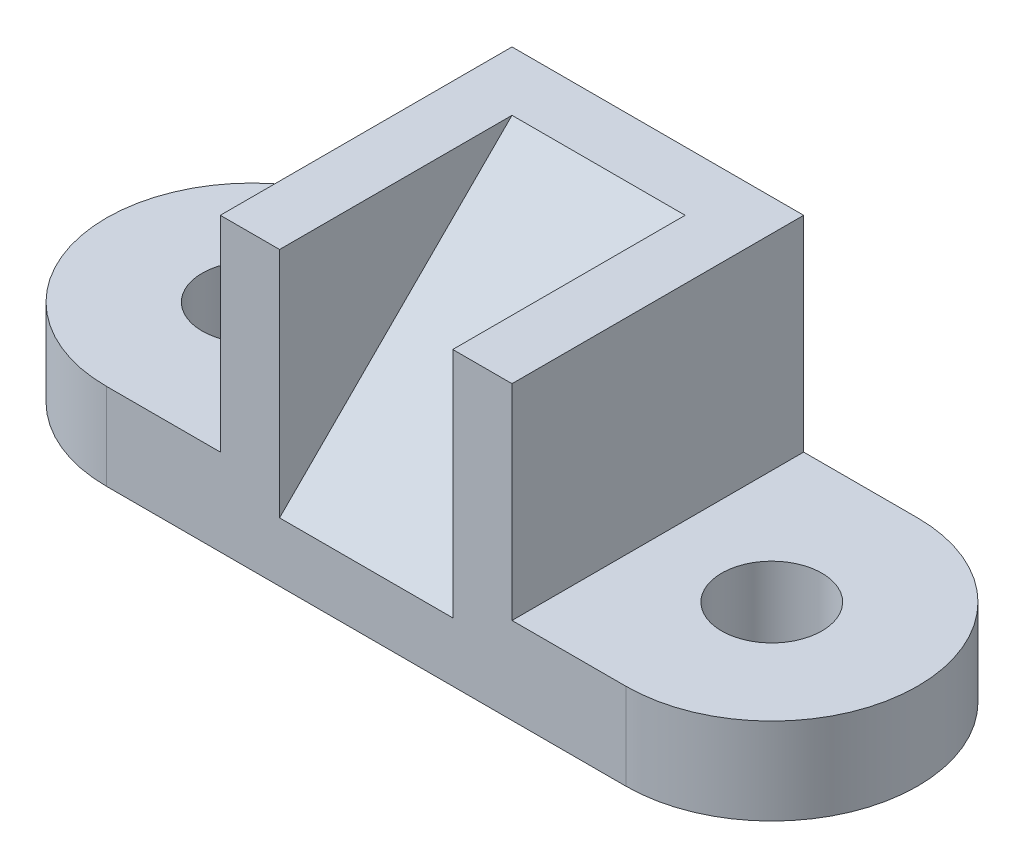
ISO-10303-21;
HEADER;
FILE_DESCRIPTION(('STEP AP214'),'2;1');
FILE_NAME('part.step','',(''),(''),'','','');
FILE_SCHEMA(('AUTOMOTIVE_DESIGN { 1 0 10303 214 1 1 1 1 }'));
ENDSEC;
DATA;
#1=APPLICATION_CONTEXT('core data for automotive mechanical design processes');
#2=APPLICATION_PROTOCOL_DEFINITION('international standard','automotive_design',2000,#1);
#3=PRODUCT_CONTEXT('',#1,'mechanical');
#4=PRODUCT('Part','Part','',(#3));
#5=PRODUCT_RELATED_PRODUCT_CATEGORY('part','',(#4));
#6=PRODUCT_DEFINITION_FORMATION('','',#4);
#7=PRODUCT_DEFINITION_CONTEXT('part definition',#1,'design');
#8=PRODUCT_DEFINITION('design','',#6,#7);
#9=PRODUCT_DEFINITION_SHAPE('','',#8);
#10=(LENGTH_UNIT() NAMED_UNIT(*) SI_UNIT(.MILLI.,.METRE.));
#11=(NAMED_UNIT(*) PLANE_ANGLE_UNIT() SI_UNIT($,.RADIAN.));
#12=(NAMED_UNIT(*) SI_UNIT($,.STERADIAN.) SOLID_ANGLE_UNIT());
#13=UNCERTAINTY_MEASURE_WITH_UNIT(LENGTH_MEASURE(1.E-05),#10,'distance_accuracy_value','');
#14=(GEOMETRIC_REPRESENTATION_CONTEXT(3) GLOBAL_UNCERTAINTY_ASSIGNED_CONTEXT((#13)) GLOBAL_UNIT_ASSIGNED_CONTEXT((#10,
#11,#12)) REPRESENTATION_CONTEXT('',''));
#15=CARTESIAN_POINT('',(0.,0.,0.));
#16=DIRECTION('',(0.,0.,1.));
#17=DIRECTION('',(1.,0.,0.));
#18=AXIS2_PLACEMENT_3D('',#15,#16,#17);
#19=CARTESIAN_POINT('',(-57.,19.,32.));
#20=DIRECTION('',(0.,0.,-1.));
#21=DIRECTION('',(-1.,0.,0.));
#22=AXIS2_PLACEMENT_3D('',#19,#20,#21);
#23=PLANE('',#22);
#24=DIRECTION('',(0.,1.,0.));
#25=VECTOR('',#24,1.);
#26=CARTESIAN_POINT('',(19.,13.,32.));
#27=LINE('',#26,#25);
#28=CARTESIAN_POINT('',(19.,13.,32.));
#29=VERTEX_POINT('',#28);
#30=CARTESIAN_POINT('',(19.,64.,32.));
#31=VERTEX_POINT('',#30);
#32=EDGE_CURVE('E129',#29,#31,#27,.T.);
#33=ORIENTED_EDGE('',*,*,#32,.F.);
#34=DIRECTION('',(-1.,0.,0.));
#35=VECTOR('',#34,1.);
#36=CARTESIAN_POINT('',(19.,13.,32.));
#37=LINE('',#36,#35);
#38=CARTESIAN_POINT('',(-19.,13.,32.));
#39=VERTEX_POINT('',#38);
#40=EDGE_CURVE('E169',#29,#39,#37,.T.);
#41=ORIENTED_EDGE('',*,*,#40,.T.);
#42=DIRECTION('',(0.,1.,0.));
#43=VECTOR('',#42,1.);
#44=CARTESIAN_POINT('',(-19.,13.,32.));
#45=LINE('',#44,#43);
#46=CARTESIAN_POINT('',(-19.,64.,32.));
#47=VERTEX_POINT('',#46);
#48=EDGE_CURVE('E282',#39,#47,#45,.T.);
#49=ORIENTED_EDGE('',*,*,#48,.T.);
#50=DIRECTION('',(1.,0.,0.));
#51=VECTOR('',#50,1.);
#52=CARTESIAN_POINT('',(-32.,64.,32.));
#53=LINE('',#52,#51);
#54=CARTESIAN_POINT('',(-32.,64.,32.));
#55=VERTEX_POINT('',#54);
#56=EDGE_CURVE('E155',#55,#47,#53,.T.);
#57=ORIENTED_EDGE('',*,*,#56,.F.);
#58=DIRECTION('',(0.,-1.,0.));
#59=VECTOR('',#58,1.);
#60=CARTESIAN_POINT('',(-32.,64.,32.));
#61=LINE('',#60,#59);
#62=CARTESIAN_POINT('',(-32.,19.,32.));
#63=VERTEX_POINT('',#62);
#64=EDGE_CURVE('E175',#55,#63,#61,.T.);
#65=ORIENTED_EDGE('',*,*,#64,.T.);
#66=DIRECTION('',(1.,0.,0.));
#67=VECTOR('',#66,1.);
#68=CARTESIAN_POINT('',(-57.,19.,32.));
#69=LINE('',#68,#67);
#70=CARTESIAN_POINT('',(-57.,19.,32.));
#71=VERTEX_POINT('',#70);
#72=EDGE_CURVE('E210',#71,#63,#69,.T.);
#73=ORIENTED_EDGE('',*,*,#72,.F.);
#74=DIRECTION('',(0.,-1.,0.));
#75=VECTOR('',#74,1.);
#76=CARTESIAN_POINT('',(-57.,19.,32.));
#77=LINE('',#76,#75);
#78=CARTESIAN_POINT('',(-57.,0.,32.));
#79=VERTEX_POINT('',#78);
#80=EDGE_CURVE('E11',#71,#79,#77,.T.);
#81=ORIENTED_EDGE('',*,*,#80,.T.);
#82=DIRECTION('',(1.,0.,0.));
#83=VECTOR('',#82,1.);
#84=CARTESIAN_POINT('',(-57.,0.,32.));
#85=LINE('',#84,#83);
#86=CARTESIAN_POINT('',(57.,0.,32.));
#87=VERTEX_POINT('',#86);
#88=EDGE_CURVE('E224',#79,#87,#85,.T.);
#89=ORIENTED_EDGE('',*,*,#88,.T.);
#90=DIRECTION('',(0.,-1.,0.));
#91=VECTOR('',#90,1.);
#92=CARTESIAN_POINT('',(57.,19.,32.));
#93=LINE('',#92,#91);
#94=CARTESIAN_POINT('',(57.,19.,32.));
#95=VERTEX_POINT('',#94);
#96=EDGE_CURVE('E54',#95,#87,#93,.T.);
#97=ORIENTED_EDGE('',*,*,#96,.F.);
#98=CARTESIAN_POINT('',(32.,19.,32.));
#99=VERTEX_POINT('',#98);
#100=EDGE_CURVE('E208',#99,#95,#69,.T.);
#101=ORIENTED_EDGE('',*,*,#100,.F.);
#102=DIRECTION('',(0.,-1.,0.));
#103=VECTOR('',#102,1.);
#104=CARTESIAN_POINT('',(32.,64.,32.));
#105=LINE('',#104,#103);
#106=CARTESIAN_POINT('',(32.,64.,32.));
#107=VERTEX_POINT('',#106);
#108=EDGE_CURVE('E152',#107,#99,#105,.T.);
#109=ORIENTED_EDGE('',*,*,#108,.F.);
#110=EDGE_CURVE('E144',#31,#107,#53,.T.);
#111=ORIENTED_EDGE('',*,*,#110,.F.);
#112=EDGE_LOOP('',(#33,#41,#49,#57,#65,#73,#81,#89,#97,#101,#109,#111));
#113=FACE_BOUND('',#112,.T.);
#114=ADVANCED_FACE('F45',(#113),#23,.F.);
#115=CARTESIAN_POINT('',(0.,64.,0.));
#116=DIRECTION('',(0.,1.,0.));
#117=DIRECTION('',(0.,0.,1.));
#118=AXIS2_PLACEMENT_3D('',#115,#116,#117);
#119=PLANE('',#118);
#120=DIRECTION('',(-1.,0.,0.));
#121=VECTOR('',#120,1.);
#122=CARTESIAN_POINT('',(19.,64.,-19.));
#123=LINE('',#122,#121);
#124=CARTESIAN_POINT('',(19.,64.,-19.));
#125=VERTEX_POINT('',#124);
#126=CARTESIAN_POINT('',(-19.,64.,-19.));
#127=VERTEX_POINT('',#126);
#128=EDGE_CURVE('E147',#125,#127,#123,.T.);
#129=ORIENTED_EDGE('',*,*,#128,.F.);
#130=DIRECTION('',(0.,0.,-1.));
#131=VECTOR('',#130,1.);
#132=CARTESIAN_POINT('',(19.,64.,32.));
#133=LINE('',#132,#131);
#134=EDGE_CURVE('E132',#31,#125,#133,.T.);
#135=ORIENTED_EDGE('',*,*,#134,.F.);
#136=ORIENTED_EDGE('',*,*,#110,.T.);
#137=DIRECTION('',(0.,0.,-1.));
#138=VECTOR('',#137,1.);
#139=CARTESIAN_POINT('',(32.,64.,-32.));
#140=LINE('',#139,#138);
#141=CARTESIAN_POINT('',(32.,64.,-32.));
#142=VERTEX_POINT('',#141);
#143=EDGE_CURVE('E172',#107,#142,#140,.T.);
#144=ORIENTED_EDGE('',*,*,#143,.T.);
#145=DIRECTION('',(-1.,0.,0.));
#146=VECTOR('',#145,1.);
#147=CARTESIAN_POINT('',(-32.,64.,-32.));
#148=LINE('',#147,#146);
#149=CARTESIAN_POINT('',(-32.,64.,-32.));
#150=VERTEX_POINT('',#149);
#151=EDGE_CURVE('E161',#142,#150,#148,.T.);
#152=ORIENTED_EDGE('',*,*,#151,.T.);
#153=DIRECTION('',(0.,0.,1.));
#154=VECTOR('',#153,1.);
#155=CARTESIAN_POINT('',(-32.,64.,-32.));
#156=LINE('',#155,#154);
#157=EDGE_CURVE('E156',#150,#55,#156,.T.);
#158=ORIENTED_EDGE('',*,*,#157,.T.);
#159=ORIENTED_EDGE('',*,*,#56,.T.);
#160=DIRECTION('',(0.,0.,-1.));
#161=VECTOR('',#160,1.);
#162=CARTESIAN_POINT('',(-19.,64.,32.));
#163=LINE('',#162,#161);
#164=EDGE_CURVE('E279',#47,#127,#163,.T.);
#165=ORIENTED_EDGE('',*,*,#164,.T.);
#166=EDGE_LOOP('',(#129,#135,#136,#144,#152,#158,#159,#165));
#167=FACE_BOUND('',#166,.T.);
#168=ADVANCED_FACE('F142',(#167),#119,.T.);
#169=CARTESIAN_POINT('',(-57.,19.,0.));
#170=DIRECTION('',(0.,1.,0.));
#171=DIRECTION('',(0.,0.,1.));
#172=AXIS2_PLACEMENT_3D('',#169,#170,#171);
#173=PLANE('',#172);
#174=DIRECTION('',(0.,0.,-1.));
#175=VECTOR('',#174,1.);
#176=CARTESIAN_POINT('',(32.,19.,-32.));
#177=LINE('',#176,#175);
#178=CARTESIAN_POINT('',(32.,19.,-32.));
#179=VERTEX_POINT('',#178);
#180=EDGE_CURVE('E165',#99,#179,#177,.T.);
#181=ORIENTED_EDGE('',*,*,#180,.F.);
#182=ORIENTED_EDGE('',*,*,#100,.T.);
#183=CARTESIAN_POINT('',(57.,19.,0.));
#184=DIRECTION('',(0.,1.,0.));
#185=DIRECTION('',(0.,0.,1.));
#186=AXIS2_PLACEMENT_3D('',#183,#184,#185);
#187=CIRCLE('',#186,32.);
#188=CARTESIAN_POINT('',(57.,19.,-32.));
#189=VERTEX_POINT('',#188);
#190=EDGE_CURVE('E213',#95,#189,#187,.T.);
#191=ORIENTED_EDGE('',*,*,#190,.T.);
#192=DIRECTION('',(-1.,0.,0.));
#193=VECTOR('',#192,1.);
#194=CARTESIAN_POINT('',(-57.,19.,-32.));
#195=LINE('',#194,#193);
#196=EDGE_CURVE('E217',#189,#179,#195,.T.);
#197=ORIENTED_EDGE('',*,*,#196,.T.);
#198=EDGE_LOOP('',(#181,#182,#191,#197));
#199=FACE_BOUND('',#198,.T.);
#200=CARTESIAN_POINT('',(57.,19.,0.));
#201=DIRECTION('',(0.,1.,0.));
#202=DIRECTION('',(0.,0.,1.));
#203=AXIS2_PLACEMENT_3D('',#200,#201,#202);
#204=CIRCLE('',#203,11.);
#205=CARTESIAN_POINT('',(57.,19.,11.));
#206=VERTEX_POINT('',#205);
#207=EDGE_CURVE('E196',#206,#206,#204,.T.);
#208=ORIENTED_EDGE('',*,*,#207,.F.);
#209=EDGE_LOOP('',(#208));
#210=FACE_BOUND('',#209,.T.);
#211=ADVANCED_FACE('F264',(#199,#210),#173,.T.);
#212=DIRECTION('',(0.,0.,1.));
#213=VECTOR('',#212,1.);
#214=CARTESIAN_POINT('',(-32.,19.,-32.));
#215=LINE('',#214,#213);
#216=CARTESIAN_POINT('',(-32.,19.,-32.));
#217=VERTEX_POINT('',#216);
#218=EDGE_CURVE('E69',#217,#63,#215,.T.);
#219=ORIENTED_EDGE('',*,*,#218,.F.);
#220=CARTESIAN_POINT('',(-57.,19.,-32.));
#221=VERTEX_POINT('',#220);
#222=EDGE_CURVE('E216',#217,#221,#195,.T.);
#223=ORIENTED_EDGE('',*,*,#222,.T.);
#224=CARTESIAN_POINT('',(-57.,19.,0.));
#225=DIRECTION('',(0.,1.,0.));
#226=DIRECTION('',(0.,0.,1.));
#227=AXIS2_PLACEMENT_3D('',#224,#225,#226);
#228=CIRCLE('',#227,32.);
#229=EDGE_CURVE('E204',#221,#71,#228,.T.);
#230=ORIENTED_EDGE('',*,*,#229,.T.);
#231=ORIENTED_EDGE('',*,*,#72,.T.);
#232=EDGE_LOOP('',(#219,#223,#230,#231));
#233=FACE_BOUND('',#232,.T.);
#234=CARTESIAN_POINT('',(-57.,19.,0.));
#235=DIRECTION('',(0.,1.,0.));
#236=DIRECTION('',(0.,0.,1.));
#237=AXIS2_PLACEMENT_3D('',#234,#235,#236);
#238=CIRCLE('',#237,11.);
#239=CARTESIAN_POINT('',(-57.,19.,11.));
#240=VERTEX_POINT('',#239);
#241=EDGE_CURVE('E188',#240,#240,#238,.T.);
#242=ORIENTED_EDGE('',*,*,#241,.F.);
#243=EDGE_LOOP('',(#242));
#244=FACE_BOUND('',#243,.T.);
#245=ADVANCED_FACE('F258',(#233,#244),#173,.T.);
#246=CARTESIAN_POINT('',(-57.,0.,0.));
#247=DIRECTION('',(0.,1.,0.));
#248=DIRECTION('',(0.,0.,1.));
#249=AXIS2_PLACEMENT_3D('',#246,#247,#248);
#250=PLANE('',#249);
#251=CARTESIAN_POINT('',(-57.,0.,0.));
#252=DIRECTION('',(0.,1.,0.));
#253=DIRECTION('',(0.,0.,1.));
#254=AXIS2_PLACEMENT_3D('',#251,#252,#253);
#255=CIRCLE('',#254,32.);
#256=CARTESIAN_POINT('',(-57.,0.,-32.));
#257=VERTEX_POINT('',#256);
#258=EDGE_CURVE('E200',#257,#79,#255,.T.);
#259=ORIENTED_EDGE('',*,*,#258,.F.);
#260=DIRECTION('',(-1.,0.,0.));
#261=VECTOR('',#260,1.);
#262=CARTESIAN_POINT('',(-57.,0.,-32.));
#263=LINE('',#262,#261);
#264=CARTESIAN_POINT('',(57.,0.,-32.));
#265=VERTEX_POINT('',#264);
#266=EDGE_CURVE('E209',#265,#257,#263,.T.);
#267=ORIENTED_EDGE('',*,*,#266,.F.);
#268=CARTESIAN_POINT('',(57.,0.,0.));
#269=DIRECTION('',(0.,1.,0.));
#270=DIRECTION('',(0.,0.,1.));
#271=AXIS2_PLACEMENT_3D('',#268,#269,#270);
#272=CIRCLE('',#271,32.);
#273=EDGE_CURVE('E227',#87,#265,#272,.T.);
#274=ORIENTED_EDGE('',*,*,#273,.F.);
#275=ORIENTED_EDGE('',*,*,#88,.F.);
#276=EDGE_LOOP('',(#259,#267,#274,#275));
#277=FACE_BOUND('',#276,.T.);
#278=CARTESIAN_POINT('',(57.,0.,0.));
#279=DIRECTION('',(0.,1.,0.));
#280=DIRECTION('',(0.,0.,1.));
#281=AXIS2_PLACEMENT_3D('',#278,#279,#280);
#282=CIRCLE('',#281,11.);
#283=CARTESIAN_POINT('',(57.,0.,11.));
#284=VERTEX_POINT('',#283);
#285=EDGE_CURVE('E192',#284,#284,#282,.T.);
#286=ORIENTED_EDGE('',*,*,#285,.T.);
#287=EDGE_LOOP('',(#286));
#288=FACE_BOUND('',#287,.T.);
#289=CARTESIAN_POINT('',(-57.,0.,0.));
#290=DIRECTION('',(0.,1.,0.));
#291=DIRECTION('',(0.,0.,1.));
#292=AXIS2_PLACEMENT_3D('',#289,#290,#291);
#293=CIRCLE('',#292,11.);
#294=CARTESIAN_POINT('',(-57.,0.,11.));
#295=VERTEX_POINT('',#294);
#296=EDGE_CURVE('E187',#295,#295,#293,.T.);
#297=ORIENTED_EDGE('',*,*,#296,.T.);
#298=EDGE_LOOP('',(#297));
#299=FACE_BOUND('',#298,.T.);
#300=ADVANCED_FACE('F249',(#277,#288,#299),#250,.F.);
#301=CARTESIAN_POINT('',(-57.,19.,0.));
#302=DIRECTION('',(0.,-1.,0.));
#303=DIRECTION('',(0.,0.,-1.));
#304=AXIS2_PLACEMENT_3D('',#301,#302,#303);
#305=CYLINDRICAL_SURFACE('',#304,32.);
#306=ORIENTED_EDGE('',*,*,#258,.T.);
#307=ORIENTED_EDGE('',*,*,#80,.F.);
#308=ORIENTED_EDGE('',*,*,#229,.F.);
#309=DIRECTION('',(0.,-1.,0.));
#310=VECTOR('',#309,1.);
#311=CARTESIAN_POINT('',(-57.,19.,-32.));
#312=LINE('',#311,#310);
#313=EDGE_CURVE('E220',#221,#257,#312,.T.);
#314=ORIENTED_EDGE('',*,*,#313,.T.);
#315=EDGE_LOOP('',(#306,#307,#308,#314));
#316=FACE_BOUND('',#315,.T.);
#317=ADVANCED_FACE('F47',(#316),#305,.T.);
#318=CARTESIAN_POINT('',(57.,19.,0.));
#319=DIRECTION('',(0.,-1.,0.));
#320=DIRECTION('',(0.,0.,-1.));
#321=AXIS2_PLACEMENT_3D('',#318,#319,#320);
#322=CYLINDRICAL_SURFACE('',#321,32.);
#323=ORIENTED_EDGE('',*,*,#273,.T.);
#324=DIRECTION('',(0.,-1.,0.));
#325=VECTOR('',#324,1.);
#326=CARTESIAN_POINT('',(57.,19.,-32.));
#327=LINE('',#326,#325);
#328=EDGE_CURVE('E235',#189,#265,#327,.T.);
#329=ORIENTED_EDGE('',*,*,#328,.F.);
#330=ORIENTED_EDGE('',*,*,#190,.F.);
#331=ORIENTED_EDGE('',*,*,#96,.T.);
#332=EDGE_LOOP('',(#323,#329,#330,#331));
#333=FACE_BOUND('',#332,.T.);
#334=ADVANCED_FACE('F244',(#333),#322,.T.);
#335=CARTESIAN_POINT('',(-57.,19.,-32.));
#336=DIRECTION('',(0.,0.,1.));
#337=DIRECTION('',(1.,0.,0.));
#338=AXIS2_PLACEMENT_3D('',#335,#336,#337);
#339=PLANE('',#338);
#340=ORIENTED_EDGE('',*,*,#266,.T.);
#341=ORIENTED_EDGE('',*,*,#313,.F.);
#342=ORIENTED_EDGE('',*,*,#222,.F.);
#343=DIRECTION('',(0.,-1.,0.));
#344=VECTOR('',#343,1.);
#345=CARTESIAN_POINT('',(-32.,64.,-32.));
#346=LINE('',#345,#344);
#347=EDGE_CURVE('E179',#150,#217,#346,.T.);
#348=ORIENTED_EDGE('',*,*,#347,.F.);
#349=ORIENTED_EDGE('',*,*,#151,.F.);
#350=DIRECTION('',(0.,-1.,0.));
#351=VECTOR('',#350,1.);
#352=CARTESIAN_POINT('',(32.,64.,-32.));
#353=LINE('',#352,#351);
#354=EDGE_CURVE('E183',#142,#179,#353,.T.);
#355=ORIENTED_EDGE('',*,*,#354,.T.);
#356=ORIENTED_EDGE('',*,*,#196,.F.);
#357=ORIENTED_EDGE('',*,*,#328,.T.);
#358=EDGE_LOOP('',(#340,#341,#342,#348,#349,#355,#356,#357));
#359=FACE_BOUND('',#358,.T.);
#360=ADVANCED_FACE('F253',(#359),#339,.F.);
#361=CARTESIAN_POINT('',(57.,19.,0.));
#362=DIRECTION('',(0.,-1.,0.));
#363=DIRECTION('',(0.,0.,-1.));
#364=AXIS2_PLACEMENT_3D('',#361,#362,#363);
#365=CYLINDRICAL_SURFACE('',#364,11.);
#366=ORIENTED_EDGE('',*,*,#207,.T.);
#367=EDGE_LOOP('',(#366));
#368=FACE_BOUND('',#367,.T.);
#369=ORIENTED_EDGE('',*,*,#285,.F.);
#370=EDGE_LOOP('',(#369));
#371=FACE_BOUND('',#370,.T.);
#372=ADVANCED_FACE('F313',(#368,#371),#365,.F.);
#373=CARTESIAN_POINT('',(-57.,19.,0.));
#374=DIRECTION('',(0.,-1.,0.));
#375=DIRECTION('',(0.,0.,-1.));
#376=AXIS2_PLACEMENT_3D('',#373,#374,#375);
#377=CYLINDRICAL_SURFACE('',#376,11.);
#378=ORIENTED_EDGE('',*,*,#241,.T.);
#379=EDGE_LOOP('',(#378));
#380=FACE_BOUND('',#379,.T.);
#381=ORIENTED_EDGE('',*,*,#296,.F.);
#382=EDGE_LOOP('',(#381));
#383=FACE_BOUND('',#382,.T.);
#384=ADVANCED_FACE('F302',(#380,#383),#377,.F.);
#385=CARTESIAN_POINT('',(32.,64.,-32.));
#386=DIRECTION('',(-1.,0.,0.));
#387=DIRECTION('',(0.,0.,1.));
#388=AXIS2_PLACEMENT_3D('',#385,#386,#387);
#389=PLANE('',#388);
#390=ORIENTED_EDGE('',*,*,#180,.T.);
#391=ORIENTED_EDGE('',*,*,#354,.F.);
#392=ORIENTED_EDGE('',*,*,#143,.F.);
#393=ORIENTED_EDGE('',*,*,#108,.T.);
#394=EDGE_LOOP('',(#390,#391,#392,#393));
#395=FACE_BOUND('',#394,.T.);
#396=ADVANCED_FACE('F267',(#395),#389,.F.);
#397=CARTESIAN_POINT('',(-32.,64.,-32.));
#398=DIRECTION('',(1.,0.,0.));
#399=DIRECTION('',(0.,0.,-1.));
#400=AXIS2_PLACEMENT_3D('',#397,#398,#399);
#401=PLANE('',#400);
#402=ORIENTED_EDGE('',*,*,#218,.T.);
#403=ORIENTED_EDGE('',*,*,#64,.F.);
#404=ORIENTED_EDGE('',*,*,#157,.F.);
#405=ORIENTED_EDGE('',*,*,#347,.T.);
#406=EDGE_LOOP('',(#402,#403,#404,#405));
#407=FACE_BOUND('',#406,.T.);
#408=ADVANCED_FACE('F291',(#407),#401,.F.);
#409=CARTESIAN_POINT('',(19.,64.,-19.));
#410=DIRECTION('',(0.,-0.707106781186548,-0.707106781186547));
#411=DIRECTION('',(0.,0.707106781186547,-0.707106781186548));
#412=AXIS2_PLACEMENT_3D('',#409,#410,#411);
#413=PLANE('',#412);
#414=DIRECTION('',(0.,-0.707106781186547,0.707106781186548));
#415=VECTOR('',#414,1.);
#416=CARTESIAN_POINT('',(-19.,64.,-19.));
#417=LINE('',#416,#415);
#418=EDGE_CURVE('E61',#127,#39,#417,.T.);
#419=ORIENTED_EDGE('',*,*,#418,.T.);
#420=ORIENTED_EDGE('',*,*,#40,.F.);
#421=DIRECTION('',(0.,-0.707106781186547,0.707106781186548));
#422=VECTOR('',#421,1.);
#423=CARTESIAN_POINT('',(19.,64.,-19.));
#424=LINE('',#423,#422);
#425=EDGE_CURVE('E134',#125,#29,#424,.T.);
#426=ORIENTED_EDGE('',*,*,#425,.F.);
#427=ORIENTED_EDGE('',*,*,#128,.T.);
#428=EDGE_LOOP('',(#419,#420,#426,#427));
#429=FACE_BOUND('',#428,.T.);
#430=ADVANCED_FACE('F293',(#429),#413,.F.);
#431=CARTESIAN_POINT('',(19.,0.,0.));
#432=DIRECTION('',(-1.,0.,0.));
#433=DIRECTION('',(0.,0.,1.));
#434=AXIS2_PLACEMENT_3D('',#431,#432,#433);
#435=PLANE('',#434);
#436=ORIENTED_EDGE('',*,*,#32,.T.);
#437=ORIENTED_EDGE('',*,*,#134,.T.);
#438=ORIENTED_EDGE('',*,*,#425,.T.);
#439=EDGE_LOOP('',(#436,#437,#438));
#440=FACE_BOUND('',#439,.T.);
#441=ADVANCED_FACE('F131',(#440),#435,.T.);
#442=CARTESIAN_POINT('',(-19.,0.,0.));
#443=DIRECTION('',(-1.,0.,0.));
#444=DIRECTION('',(0.,0.,1.));
#445=AXIS2_PLACEMENT_3D('',#442,#443,#444);
#446=PLANE('',#445);
#447=ORIENTED_EDGE('',*,*,#48,.F.);
#448=ORIENTED_EDGE('',*,*,#418,.F.);
#449=ORIENTED_EDGE('',*,*,#164,.F.);
#450=EDGE_LOOP('',(#447,#448,#449));
#451=FACE_BOUND('',#450,.T.);
#452=ADVANCED_FACE('F384',(#451),#446,.F.);
#453=CLOSED_SHELL('',(#114,#168,#211,#245,#300,#317,#334,#360,#372,#384,#396,#408,#430,#441,#452));
#454=MANIFOLD_SOLID_BREP('B2',#453);
#455=ADVANCED_BREP_SHAPE_REPRESENTATION('',(#18,#454),#14);
#456=SHAPE_DEFINITION_REPRESENTATION(#9,#455);
ENDSEC;
END-ISO-10303-21;
